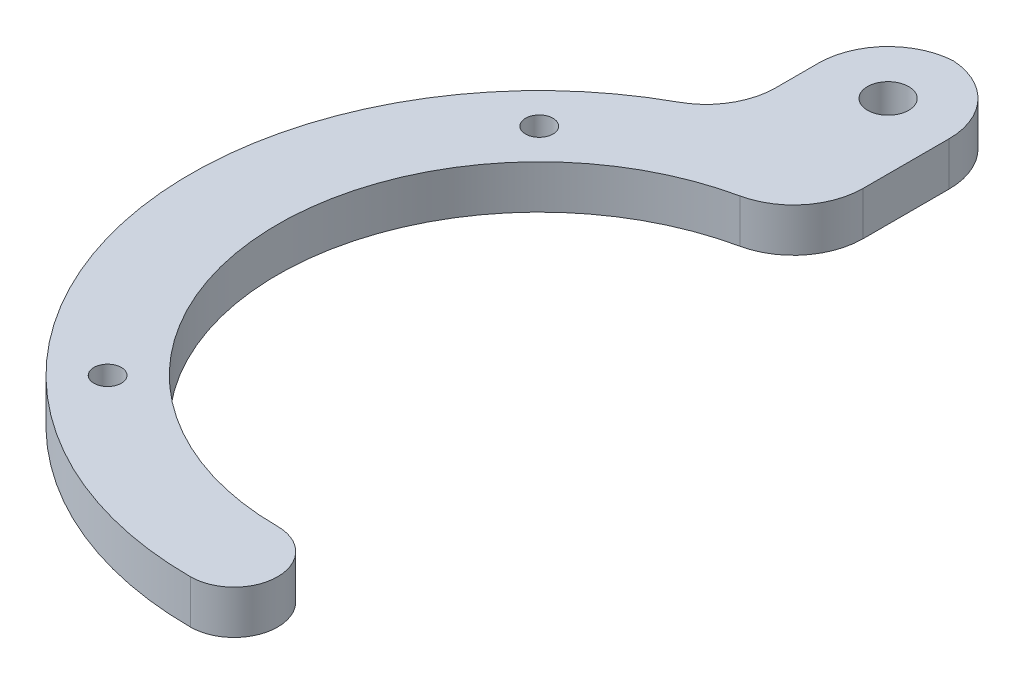
ISO-10303-21;
HEADER;
FILE_DESCRIPTION(('STEP AP214'),'2;1');
FILE_NAME('part.step','',(''),(''),'','','');
FILE_SCHEMA(('AUTOMOTIVE_DESIGN { 1 0 10303 214 1 1 1 1 }'));
ENDSEC;
DATA;
#1=APPLICATION_CONTEXT('core data for automotive mechanical design processes');
#2=APPLICATION_PROTOCOL_DEFINITION('international standard','automotive_design',2000,#1);
#3=PRODUCT_CONTEXT('',#1,'mechanical');
#4=PRODUCT('Part','Part','',(#3));
#5=PRODUCT_RELATED_PRODUCT_CATEGORY('part','',(#4));
#6=PRODUCT_DEFINITION_FORMATION('','',#4);
#7=PRODUCT_DEFINITION_CONTEXT('part definition',#1,'design');
#8=PRODUCT_DEFINITION('design','',#6,#7);
#9=PRODUCT_DEFINITION_SHAPE('','',#8);
#10=(LENGTH_UNIT() NAMED_UNIT(*) SI_UNIT(.MILLI.,.METRE.));
#11=(NAMED_UNIT(*) PLANE_ANGLE_UNIT() SI_UNIT($,.RADIAN.));
#12=(NAMED_UNIT(*) SI_UNIT($,.STERADIAN.) SOLID_ANGLE_UNIT());
#13=UNCERTAINTY_MEASURE_WITH_UNIT(LENGTH_MEASURE(1.E-05),#10,'distance_accuracy_value','');
#14=(GEOMETRIC_REPRESENTATION_CONTEXT(3) GLOBAL_UNCERTAINTY_ASSIGNED_CONTEXT((#13)) GLOBAL_UNIT_ASSIGNED_CONTEXT((#10,
#11,#12)) REPRESENTATION_CONTEXT('',''));
#15=CARTESIAN_POINT('',(0.,0.,0.));
#16=DIRECTION('',(0.,0.,1.));
#17=DIRECTION('',(1.,0.,0.));
#18=AXIS2_PLACEMENT_3D('',#15,#16,#17);
#19=CARTESIAN_POINT('',(19.05,6.35,114.3));
#20=DIRECTION('',(0.,-1.,0.));
#21=DIRECTION('',(0.,0.,-1.));
#22=AXIS2_PLACEMENT_3D('',#19,#20,#21);
#23=CYLINDRICAL_SURFACE('',#22,6.34999999999999);
#24=CARTESIAN_POINT('',(19.05,0.,114.3));
#25=DIRECTION('',(0.,1.,0.));
#26=DIRECTION('',(0.,0.,1.));
#27=AXIS2_PLACEMENT_3D('',#24,#25,#26);
#28=CIRCLE('',#27,6.34999999999999);
#29=CARTESIAN_POINT('',(19.05,0.,107.95));
#30=VERTEX_POINT('',#29);
#31=CARTESIAN_POINT('',(19.05,0.,120.65));
#32=VERTEX_POINT('',#31);
#33=EDGE_CURVE('E121',#30,#32,#28,.F.);
#34=ORIENTED_EDGE('',*,*,#33,.F.);
#35=DIRECTION('',(0.,-1.,0.));
#36=VECTOR('',#35,1.);
#37=CARTESIAN_POINT('',(19.05,6.35,107.95));
#38=LINE('',#37,#36);
#39=CARTESIAN_POINT('',(19.05,6.35,107.95));
#40=VERTEX_POINT('',#39);
#41=EDGE_CURVE('E110',#40,#30,#38,.T.);
#42=ORIENTED_EDGE('',*,*,#41,.F.);
#43=CARTESIAN_POINT('',(19.05,6.35,114.3));
#44=DIRECTION('',(0.,1.,0.));
#45=DIRECTION('',(0.,0.,1.));
#46=AXIS2_PLACEMENT_3D('',#43,#44,#45);
#47=CIRCLE('',#46,6.34999999999999);
#48=CARTESIAN_POINT('',(19.05,6.35,120.65));
#49=VERTEX_POINT('',#48);
#50=EDGE_CURVE('E115',#40,#49,#47,.F.);
#51=ORIENTED_EDGE('',*,*,#50,.T.);
#52=DIRECTION('',(0.,-1.,0.));
#53=VECTOR('',#52,1.);
#54=CARTESIAN_POINT('',(19.05,6.35,120.65));
#55=LINE('',#54,#53);
#56=EDGE_CURVE('E123',#49,#32,#55,.T.);
#57=ORIENTED_EDGE('',*,*,#56,.T.);
#58=EDGE_LOOP('',(#34,#42,#51,#57));
#59=FACE_BOUND('',#58,.T.);
#60=ADVANCED_FACE('F36',(#59),#23,.T.);
#61=CARTESIAN_POINT('',(19.05,6.35,69.85));
#62=DIRECTION('',(0.,-1.,0.));
#63=DIRECTION('',(0.,0.,-1.));
#64=AXIS2_PLACEMENT_3D('',#61,#62,#63);
#65=CYLINDRICAL_SURFACE('',#64,38.1);
#66=CARTESIAN_POINT('',(19.05,0.,69.85));
#67=DIRECTION('',(0.,1.,0.));
#68=DIRECTION('',(0.,0.,1.));
#69=AXIS2_PLACEMENT_3D('',#66,#67,#68);
#70=CIRCLE('',#69,38.1);
#71=CARTESIAN_POINT('',(11.0289473684211,0.,32.6038899389286));
#72=VERTEX_POINT('',#71);
#73=EDGE_CURVE('E152',#72,#30,#70,.T.);
#74=ORIENTED_EDGE('',*,*,#73,.F.);
#75=DIRECTION('',(0.,-1.,0.));
#76=VECTOR('',#75,1.);
#77=CARTESIAN_POINT('',(11.0289473684211,6.35,32.6038899389286));
#78=LINE('',#77,#76);
#79=CARTESIAN_POINT('',(11.0289473684211,6.35,32.6038899389286));
#80=VERTEX_POINT('',#79);
#81=EDGE_CURVE('E60',#72,#80,#78,.F.);
#82=ORIENTED_EDGE('',*,*,#81,.T.);
#83=CARTESIAN_POINT('',(19.05,6.35,69.85));
#84=DIRECTION('',(0.,1.,0.));
#85=DIRECTION('',(0.,0.,1.));
#86=AXIS2_PLACEMENT_3D('',#83,#84,#85);
#87=CIRCLE('',#86,38.1);
#88=EDGE_CURVE('E107',#80,#40,#87,.T.);
#89=ORIENTED_EDGE('',*,*,#88,.T.);
#90=ORIENTED_EDGE('',*,*,#41,.T.);
#91=EDGE_LOOP('',(#74,#82,#89,#90));
#92=FACE_BOUND('',#91,.T.);
#93=ADVANCED_FACE('F109',(#92),#65,.F.);
#94=CARTESIAN_POINT('',(19.05,6.35,0.));
#95=DIRECTION('',(-1.,0.,0.));
#96=DIRECTION('',(0.,0.,1.));
#97=AXIS2_PLACEMENT_3D('',#94,#95,#96);
#98=PLANE('',#97);
#99=DIRECTION('',(0.,0.,-1.));
#100=VECTOR('',#99,1.);
#101=CARTESIAN_POINT('',(19.05,6.35,0.));
#102=LINE('',#101,#100);
#103=CARTESIAN_POINT('',(19.05,6.35,22.6715939226429));
#104=VERTEX_POINT('',#103);
#105=CARTESIAN_POINT('',(19.05,6.35,10.16));
#106=VERTEX_POINT('',#105);
#107=EDGE_CURVE('E114',#104,#106,#102,.T.);
#108=ORIENTED_EDGE('',*,*,#107,.F.);
#109=DIRECTION('',(0.,1.,0.));
#110=VECTOR('',#109,1.);
#111=CARTESIAN_POINT('',(19.05,0.,22.6715939226429));
#112=LINE('',#111,#110);
#113=CARTESIAN_POINT('',(19.05,0.,22.6715939226429));
#114=VERTEX_POINT('',#113);
#115=EDGE_CURVE('E175',#104,#114,#112,.F.);
#116=ORIENTED_EDGE('',*,*,#115,.T.);
#117=DIRECTION('',(0.,0.,-1.));
#118=VECTOR('',#117,1.);
#119=CARTESIAN_POINT('',(19.05,0.,0.));
#120=LINE('',#119,#118);
#121=CARTESIAN_POINT('',(19.05,0.,10.16));
#122=VERTEX_POINT('',#121);
#123=EDGE_CURVE('E154',#114,#122,#120,.T.);
#124=ORIENTED_EDGE('',*,*,#123,.T.);
#125=DIRECTION('',(0.,-1.,0.));
#126=VECTOR('',#125,1.);
#127=CARTESIAN_POINT('',(19.05,6.35,10.16));
#128=LINE('',#127,#126);
#129=EDGE_CURVE('E173',#122,#106,#128,.F.);
#130=ORIENTED_EDGE('',*,*,#129,.T.);
#131=EDGE_LOOP('',(#108,#116,#124,#130));
#132=FACE_BOUND('',#131,.T.);
#133=ADVANCED_FACE('F212',(#132),#98,.F.);
#134=CARTESIAN_POINT('',(0.,6.35,0.));
#135=DIRECTION('',(1.,0.,0.));
#136=DIRECTION('',(0.,0.,-1.));
#137=AXIS2_PLACEMENT_3D('',#134,#135,#136);
#138=PLANE('',#137);
#139=DIRECTION('',(0.,0.,1.));
#140=VECTOR('',#139,1.);
#141=CARTESIAN_POINT('',(0.,0.,0.));
#142=LINE('',#141,#140);
#143=CARTESIAN_POINT('',(0.,0.,10.16));
#144=VERTEX_POINT('',#143);
#145=CARTESIAN_POINT('',(0.,0.,16.3439489403301));
#146=VERTEX_POINT('',#145);
#147=EDGE_CURVE('E157',#144,#146,#142,.T.);
#148=ORIENTED_EDGE('',*,*,#147,.T.);
#149=DIRECTION('',(0.,1.,0.));
#150=VECTOR('',#149,1.);
#151=CARTESIAN_POINT('',(0.,6.35,16.3439489403301));
#152=LINE('',#151,#150);
#153=CARTESIAN_POINT('',(0.,6.35,16.3439489403301));
#154=VERTEX_POINT('',#153);
#155=EDGE_CURVE('E171',#146,#154,#152,.T.);
#156=ORIENTED_EDGE('',*,*,#155,.T.);
#157=DIRECTION('',(0.,0.,1.));
#158=VECTOR('',#157,1.);
#159=CARTESIAN_POINT('',(0.,6.35,0.));
#160=LINE('',#159,#158);
#161=CARTESIAN_POINT('',(0.,6.35,10.16));
#162=VERTEX_POINT('',#161);
#163=EDGE_CURVE('E138',#162,#154,#160,.T.);
#164=ORIENTED_EDGE('',*,*,#163,.F.);
#165=DIRECTION('',(0.,-1.,0.));
#166=VECTOR('',#165,1.);
#167=CARTESIAN_POINT('',(0.,0.,10.16));
#168=LINE('',#167,#166);
#169=EDGE_CURVE('E168',#162,#144,#168,.T.);
#170=ORIENTED_EDGE('',*,*,#169,.T.);
#171=EDGE_LOOP('',(#148,#156,#164,#170));
#172=FACE_BOUND('',#171,.T.);
#173=ADVANCED_FACE('F200',(#172),#138,.F.);
#174=CARTESIAN_POINT('',(19.05,6.35,69.85));
#175=DIRECTION('',(0.,-1.,0.));
#176=DIRECTION('',(0.,0.,-1.));
#177=AXIS2_PLACEMENT_3D('',#174,#175,#176);
#178=CYLINDRICAL_SURFACE('',#177,50.8);
#179=CARTESIAN_POINT('',(19.05,6.35,69.85));
#180=DIRECTION('',(0.,1.,0.));
#181=DIRECTION('',(0.,0.,1.));
#182=AXIS2_PLACEMENT_3D('',#179,#180,#181);
#183=CIRCLE('',#182,50.8);
#184=CARTESIAN_POINT('',(-5.29166666666666,6.35,25.2616241169418));
#185=VERTEX_POINT('',#184);
#186=EDGE_CURVE('E128',#185,#49,#183,.T.);
#187=ORIENTED_EDGE('',*,*,#186,.F.);
#188=DIRECTION('',(0.,-1.,0.));
#189=VECTOR('',#188,1.);
#190=CARTESIAN_POINT('',(-5.29166666666667,6.35,25.2616241169418));
#191=LINE('',#190,#189);
#192=CARTESIAN_POINT('',(-5.29166666666666,0.,25.2616241169418));
#193=VERTEX_POINT('',#192);
#194=EDGE_CURVE('E122',#185,#193,#191,.T.);
#195=ORIENTED_EDGE('',*,*,#194,.T.);
#196=CARTESIAN_POINT('',(19.05,0.,69.85));
#197=DIRECTION('',(0.,1.,0.));
#198=DIRECTION('',(0.,0.,1.));
#199=AXIS2_PLACEMENT_3D('',#196,#197,#198);
#200=CIRCLE('',#199,50.8);
#201=EDGE_CURVE('E160',#193,#32,#200,.T.);
#202=ORIENTED_EDGE('',*,*,#201,.T.);
#203=ORIENTED_EDGE('',*,*,#56,.F.);
#204=EDGE_LOOP('',(#187,#195,#202,#203));
#205=FACE_BOUND('',#204,.T.);
#206=ADVANCED_FACE('F206',(#205),#178,.T.);
#207=CARTESIAN_POINT('',(-12.3808964237419,6.35,38.4191035762578));
#208=DIRECTION('',(0.,-1.,0.));
#209=DIRECTION('',(0.,0.,-1.));
#210=AXIS2_PLACEMENT_3D('',#207,#208,#209);
#211=CYLINDRICAL_SURFACE('',#210,1.99999999999997);
#212=CARTESIAN_POINT('',(-12.3808964237419,6.35,38.4191035762578));
#213=DIRECTION('',(0.,1.,0.));
#214=DIRECTION('',(0.,0.,1.));
#215=AXIS2_PLACEMENT_3D('',#212,#213,#214);
#216=CIRCLE('',#215,1.99999999999997);
#217=CARTESIAN_POINT('',(-12.3808964237419,6.35,40.4191035762578));
#218=VERTEX_POINT('',#217);
#219=EDGE_CURVE('E130',#218,#218,#216,.T.);
#220=ORIENTED_EDGE('',*,*,#219,.T.);
#221=EDGE_LOOP('',(#220));
#222=FACE_BOUND('',#221,.T.);
#223=CARTESIAN_POINT('',(-12.3808964237419,0.,38.4191035762578));
#224=DIRECTION('',(0.,1.,0.));
#225=DIRECTION('',(0.,0.,1.));
#226=AXIS2_PLACEMENT_3D('',#223,#224,#225);
#227=CIRCLE('',#226,1.99999999999997);
#228=CARTESIAN_POINT('',(-12.3808964237419,0.,40.4191035762578));
#229=VERTEX_POINT('',#228);
#230=EDGE_CURVE('E148',#229,#229,#227,.T.);
#231=ORIENTED_EDGE('',*,*,#230,.F.);
#232=EDGE_LOOP('',(#231));
#233=FACE_BOUND('',#232,.T.);
#234=ADVANCED_FACE('F233',(#222,#233),#211,.F.);
#235=CARTESIAN_POINT('',(-12.3808964237421,6.35,101.280896423742));
#236=DIRECTION('',(0.,-1.,0.));
#237=DIRECTION('',(0.,0.,-1.));
#238=AXIS2_PLACEMENT_3D('',#235,#236,#237);
#239=CYLINDRICAL_SURFACE('',#238,2.);
#240=CARTESIAN_POINT('',(-12.3808964237421,6.35,101.280896423742));
#241=DIRECTION('',(0.,1.,0.));
#242=DIRECTION('',(0.,0.,1.));
#243=AXIS2_PLACEMENT_3D('',#240,#241,#242);
#244=CIRCLE('',#243,2.);
#245=CARTESIAN_POINT('',(-12.3808964237421,6.35,103.280896423742));
#246=VERTEX_POINT('',#245);
#247=EDGE_CURVE('E133',#246,#246,#244,.T.);
#248=ORIENTED_EDGE('',*,*,#247,.T.);
#249=EDGE_LOOP('',(#248));
#250=FACE_BOUND('',#249,.T.);
#251=CARTESIAN_POINT('',(-12.3808964237421,0.,101.280896423742));
#252=DIRECTION('',(0.,1.,0.));
#253=DIRECTION('',(0.,0.,1.));
#254=AXIS2_PLACEMENT_3D('',#251,#252,#253);
#255=CIRCLE('',#254,2.);
#256=CARTESIAN_POINT('',(-12.3808964237421,0.,103.280896423742));
#257=VERTEX_POINT('',#256);
#258=EDGE_CURVE('E145',#257,#257,#255,.T.);
#259=ORIENTED_EDGE('',*,*,#258,.F.);
#260=EDGE_LOOP('',(#259));
#261=FACE_BOUND('',#260,.T.);
#262=ADVANCED_FACE('F236',(#250,#261),#239,.F.);
#263=CARTESIAN_POINT('',(9.525,6.35,9.525));
#264=DIRECTION('',(0.,-1.,0.));
#265=DIRECTION('',(0.,0.,-1.));
#266=AXIS2_PLACEMENT_3D('',#263,#264,#265);
#267=CYLINDRICAL_SURFACE('',#266,3.);
#268=CARTESIAN_POINT('',(9.525,6.35,9.525));
#269=DIRECTION('',(0.,1.,0.));
#270=DIRECTION('',(0.,0.,1.));
#271=AXIS2_PLACEMENT_3D('',#268,#269,#270);
#272=CIRCLE('',#271,3.);
#273=CARTESIAN_POINT('',(9.525,6.35,12.525));
#274=VERTEX_POINT('',#273);
#275=EDGE_CURVE('E142',#274,#274,#272,.T.);
#276=ORIENTED_EDGE('',*,*,#275,.T.);
#277=EDGE_LOOP('',(#276));
#278=FACE_BOUND('',#277,.T.);
#279=CARTESIAN_POINT('',(9.525,0.,9.525));
#280=DIRECTION('',(0.,1.,0.));
#281=DIRECTION('',(0.,0.,1.));
#282=AXIS2_PLACEMENT_3D('',#279,#280,#281);
#283=CIRCLE('',#282,3.);
#284=CARTESIAN_POINT('',(9.525,0.,12.525));
#285=VERTEX_POINT('',#284);
#286=EDGE_CURVE('E162',#285,#285,#283,.T.);
#287=ORIENTED_EDGE('',*,*,#286,.F.);
#288=EDGE_LOOP('',(#287));
#289=FACE_BOUND('',#288,.T.);
#290=ADVANCED_FACE('F240',(#278,#289),#267,.F.);
#291=CARTESIAN_POINT('',(0.,6.35,0.));
#292=DIRECTION('',(0.,1.,0.));
#293=DIRECTION('',(0.,0.,1.));
#294=AXIS2_PLACEMENT_3D('',#291,#292,#293);
#295=PLANE('',#294);
#296=ORIENTED_EDGE('',*,*,#247,.F.);
#297=EDGE_LOOP('',(#296));
#298=FACE_BOUND('',#297,.T.);
#299=ORIENTED_EDGE('',*,*,#219,.F.);
#300=EDGE_LOOP('',(#299));
#301=FACE_BOUND('',#300,.T.);
#302=ORIENTED_EDGE('',*,*,#88,.F.);
#303=CARTESIAN_POINT('',(8.89,6.35,22.6715939226429));
#304=DIRECTION('',(0.,1.,0.));
#305=DIRECTION('',(0.,0.,1.));
#306=AXIS2_PLACEMENT_3D('',#303,#304,#305);
#307=CIRCLE('',#306,10.16);
#308=EDGE_CURVE('E188',#80,#104,#307,.T.);
#309=ORIENTED_EDGE('',*,*,#308,.T.);
#310=ORIENTED_EDGE('',*,*,#107,.T.);
#311=CARTESIAN_POINT('',(8.88999999999999,6.35,10.16));
#312=DIRECTION('',(0.,1.,0.));
#313=DIRECTION('',(0.,0.,1.));
#314=AXIS2_PLACEMENT_3D('',#311,#312,#313);
#315=CIRCLE('',#314,10.16);
#316=CARTESIAN_POINT('',(9.525,6.35,0.0198631666037171));
#317=VERTEX_POINT('',#316);
#318=EDGE_CURVE('E52',#106,#317,#315,.T.);
#319=ORIENTED_EDGE('',*,*,#318,.T.);
#320=CARTESIAN_POINT('',(10.16,6.35,10.16));
#321=DIRECTION('',(0.,1.,0.));
#322=DIRECTION('',(0.,0.,1.));
#323=AXIS2_PLACEMENT_3D('',#320,#321,#322);
#324=CIRCLE('',#323,10.16);
#325=EDGE_CURVE('E186',#317,#162,#324,.T.);
#326=ORIENTED_EDGE('',*,*,#325,.T.);
#327=ORIENTED_EDGE('',*,*,#163,.T.);
#328=CARTESIAN_POINT('',(-10.16,6.35,16.3439489403301));
#329=DIRECTION('',(0.,1.,0.));
#330=DIRECTION('',(0.,0.,1.));
#331=AXIS2_PLACEMENT_3D('',#328,#329,#330);
#332=CIRCLE('',#331,10.16);
#333=EDGE_CURVE('E11',#154,#185,#332,.F.);
#334=ORIENTED_EDGE('',*,*,#333,.T.);
#335=ORIENTED_EDGE('',*,*,#186,.T.);
#336=ORIENTED_EDGE('',*,*,#50,.F.);
#337=EDGE_LOOP('',(#302,#309,#310,#319,#326,#327,#334,#335,#336));
#338=FACE_BOUND('',#337,.T.);
#339=ORIENTED_EDGE('',*,*,#275,.F.);
#340=EDGE_LOOP('',(#339));
#341=FACE_BOUND('',#340,.T.);
#342=ADVANCED_FACE('F125',(#298,#301,#338,#341),#295,.T.);
#343=CARTESIAN_POINT('',(0.,0.,0.));
#344=DIRECTION('',(0.,1.,0.));
#345=DIRECTION('',(0.,0.,1.));
#346=AXIS2_PLACEMENT_3D('',#343,#344,#345);
#347=PLANE('',#346);
#348=ORIENTED_EDGE('',*,*,#258,.T.);
#349=EDGE_LOOP('',(#348));
#350=FACE_BOUND('',#349,.T.);
#351=ORIENTED_EDGE('',*,*,#230,.T.);
#352=EDGE_LOOP('',(#351));
#353=FACE_BOUND('',#352,.T.);
#354=ORIENTED_EDGE('',*,*,#123,.F.);
#355=CARTESIAN_POINT('',(8.89,0.,22.6715939226429));
#356=DIRECTION('',(0.,1.,0.));
#357=DIRECTION('',(0.,0.,1.));
#358=AXIS2_PLACEMENT_3D('',#355,#356,#357);
#359=CIRCLE('',#358,10.16);
#360=EDGE_CURVE('E182',#114,#72,#359,.F.);
#361=ORIENTED_EDGE('',*,*,#360,.T.);
#362=ORIENTED_EDGE('',*,*,#73,.T.);
#363=ORIENTED_EDGE('',*,*,#33,.T.);
#364=ORIENTED_EDGE('',*,*,#201,.F.);
#365=CARTESIAN_POINT('',(-10.16,0.,16.3439489403301));
#366=DIRECTION('',(0.,1.,0.));
#367=DIRECTION('',(0.,0.,1.));
#368=AXIS2_PLACEMENT_3D('',#365,#366,#367);
#369=CIRCLE('',#368,10.16);
#370=EDGE_CURVE('E45',#193,#146,#369,.T.);
#371=ORIENTED_EDGE('',*,*,#370,.T.);
#372=ORIENTED_EDGE('',*,*,#147,.F.);
#373=CARTESIAN_POINT('',(10.16,0.,10.16));
#374=DIRECTION('',(0.,1.,0.));
#375=DIRECTION('',(0.,0.,1.));
#376=AXIS2_PLACEMENT_3D('',#373,#374,#375);
#377=CIRCLE('',#376,10.16);
#378=CARTESIAN_POINT('',(9.525,0.,0.0198631666037171));
#379=VERTEX_POINT('',#378);
#380=EDGE_CURVE('E180',#144,#379,#377,.F.);
#381=ORIENTED_EDGE('',*,*,#380,.T.);
#382=CARTESIAN_POINT('',(8.88999999999999,0.,10.16));
#383=DIRECTION('',(0.,1.,0.));
#384=DIRECTION('',(0.,0.,1.));
#385=AXIS2_PLACEMENT_3D('',#382,#383,#384);
#386=CIRCLE('',#385,10.16);
#387=EDGE_CURVE('E178',#379,#122,#386,.F.);
#388=ORIENTED_EDGE('',*,*,#387,.T.);
#389=EDGE_LOOP('',(#354,#361,#362,#363,#364,#371,#372,#381,#388));
#390=FACE_BOUND('',#389,.T.);
#391=ORIENTED_EDGE('',*,*,#286,.T.);
#392=EDGE_LOOP('',(#391));
#393=FACE_BOUND('',#392,.T.);
#394=ADVANCED_FACE('F194',(#350,#353,#390,#393),#347,.F.);
#395=CARTESIAN_POINT('',(-10.16,6.35,16.3439489403301));
#396=DIRECTION('',(0.,-1.,0.));
#397=DIRECTION('',(0.,0.,-1.));
#398=AXIS2_PLACEMENT_3D('',#395,#396,#397);
#399=CYLINDRICAL_SURFACE('',#398,10.16);
#400=ORIENTED_EDGE('',*,*,#333,.F.);
#401=ORIENTED_EDGE('',*,*,#155,.F.);
#402=ORIENTED_EDGE('',*,*,#370,.F.);
#403=ORIENTED_EDGE('',*,*,#194,.F.);
#404=EDGE_LOOP('',(#400,#401,#402,#403));
#405=FACE_BOUND('',#404,.T.);
#406=ADVANCED_FACE('F204',(#405),#399,.F.);
#407=CARTESIAN_POINT('',(8.89,6.35,22.6715939226429));
#408=DIRECTION('',(0.,-1.,0.));
#409=DIRECTION('',(0.,0.,-1.));
#410=AXIS2_PLACEMENT_3D('',#407,#408,#409);
#411=CYLINDRICAL_SURFACE('',#410,10.16);
#412=ORIENTED_EDGE('',*,*,#308,.F.);
#413=ORIENTED_EDGE('',*,*,#81,.F.);
#414=ORIENTED_EDGE('',*,*,#360,.F.);
#415=ORIENTED_EDGE('',*,*,#115,.F.);
#416=EDGE_LOOP('',(#412,#413,#414,#415));
#417=FACE_BOUND('',#416,.T.);
#418=ADVANCED_FACE('F208',(#417),#411,.T.);
#419=CARTESIAN_POINT('',(8.88999999999999,6.35,10.16));
#420=DIRECTION('',(0.,1.,0.));
#421=DIRECTION('',(0.,0.,1.));
#422=AXIS2_PLACEMENT_3D('',#419,#420,#421);
#423=CYLINDRICAL_SURFACE('',#422,10.16);
#424=DIRECTION('',(0.,1.,0.));
#425=VECTOR('',#424,1.);
#426=CARTESIAN_POINT('',(9.525,3.175,0.0198631666037171));
#427=LINE('',#426,#425);
#428=EDGE_CURVE('E40',#317,#379,#427,.F.);
#429=ORIENTED_EDGE('',*,*,#428,.F.);
#430=ORIENTED_EDGE('',*,*,#318,.F.);
#431=ORIENTED_EDGE('',*,*,#129,.F.);
#432=ORIENTED_EDGE('',*,*,#387,.F.);
#433=EDGE_LOOP('',(#429,#430,#431,#432));
#434=FACE_BOUND('',#433,.T.);
#435=ADVANCED_FACE('F38',(#434),#423,.T.);
#436=CARTESIAN_POINT('',(10.16,6.35,10.16));
#437=DIRECTION('',(0.,1.,0.));
#438=DIRECTION('',(0.,0.,1.));
#439=AXIS2_PLACEMENT_3D('',#436,#437,#438);
#440=CYLINDRICAL_SURFACE('',#439,10.16);
#441=ORIENTED_EDGE('',*,*,#325,.F.);
#442=ORIENTED_EDGE('',*,*,#428,.T.);
#443=ORIENTED_EDGE('',*,*,#380,.F.);
#444=ORIENTED_EDGE('',*,*,#169,.F.);
#445=EDGE_LOOP('',(#441,#442,#443,#444));
#446=FACE_BOUND('',#445,.T.);
#447=ADVANCED_FACE('F219',(#446),#440,.T.);
#448=CLOSED_SHELL('',(#60,#93,#133,#173,#206,#234,#262,#290,#342,#394,#406,#418,#435,#447));
#449=MANIFOLD_SOLID_BREP('B2',#448);
#450=ADVANCED_BREP_SHAPE_REPRESENTATION('',(#18,#449),#14);
#451=SHAPE_DEFINITION_REPRESENTATION(#9,#450);
ENDSEC;
END-ISO-10303-21;
